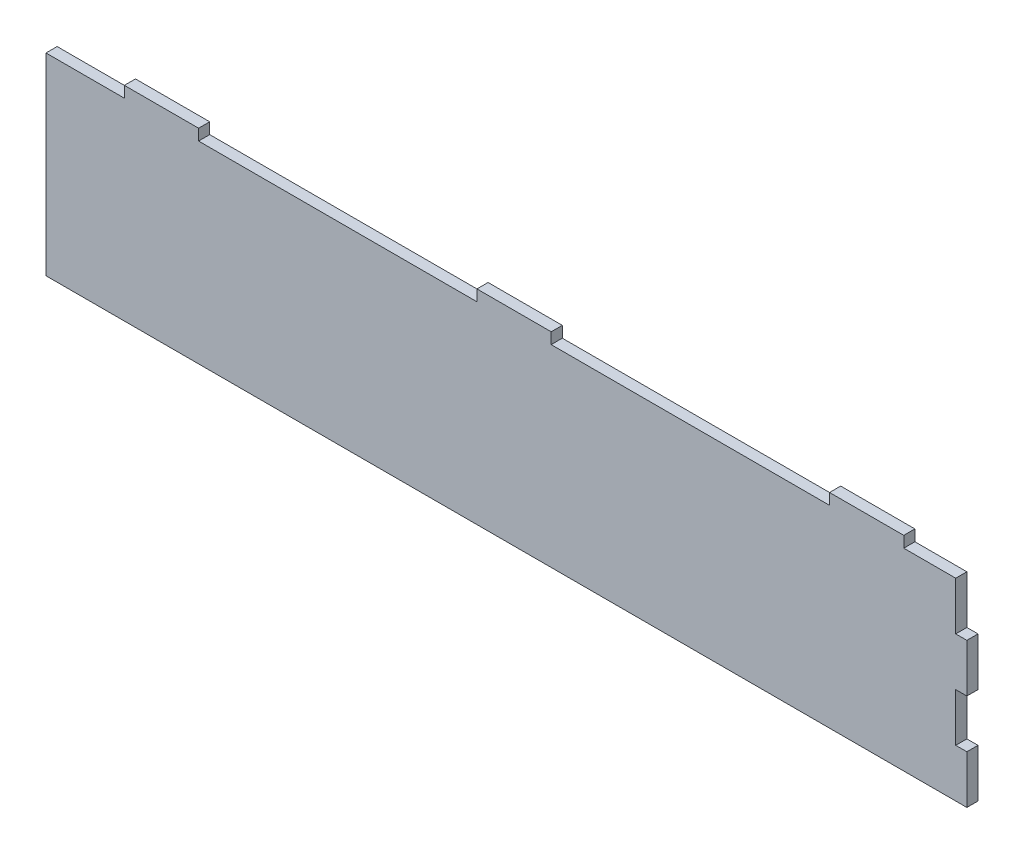
ISO-10303-21;
HEADER;
FILE_DESCRIPTION(('STEP AP214'),'2;1');
FILE_NAME('part.step','',(''),(''),'','','');
FILE_SCHEMA(('AUTOMOTIVE_DESIGN { 1 0 10303 214 1 1 1 1 }'));
ENDSEC;
DATA;
#1=APPLICATION_CONTEXT('core data for automotive mechanical design processes');
#2=APPLICATION_PROTOCOL_DEFINITION('international standard','automotive_design',2000,#1);
#3=PRODUCT_CONTEXT('',#1,'mechanical');
#4=PRODUCT('Part','Part','',(#3));
#5=PRODUCT_RELATED_PRODUCT_CATEGORY('part','',(#4));
#6=PRODUCT_DEFINITION_FORMATION('','',#4);
#7=PRODUCT_DEFINITION_CONTEXT('part definition',#1,'design');
#8=PRODUCT_DEFINITION('design','',#6,#7);
#9=PRODUCT_DEFINITION_SHAPE('','',#8);
#10=(LENGTH_UNIT() NAMED_UNIT(*) SI_UNIT(.MILLI.,.METRE.));
#11=(NAMED_UNIT(*) PLANE_ANGLE_UNIT() SI_UNIT($,.RADIAN.));
#12=(NAMED_UNIT(*) SI_UNIT($,.STERADIAN.) SOLID_ANGLE_UNIT());
#13=UNCERTAINTY_MEASURE_WITH_UNIT(LENGTH_MEASURE(1.E-05),#10,'distance_accuracy_value','');
#14=(GEOMETRIC_REPRESENTATION_CONTEXT(3) GLOBAL_UNCERTAINTY_ASSIGNED_CONTEXT((#13)) GLOBAL_UNIT_ASSIGNED_CONTEXT((#10,
#11,#12)) REPRESENTATION_CONTEXT('',''));
#15=CARTESIAN_POINT('',(0.,0.,0.));
#16=DIRECTION('',(0.,0.,1.));
#17=DIRECTION('',(1.,0.,0.));
#18=AXIS2_PLACEMENT_3D('',#15,#16,#17);
#19=CARTESIAN_POINT('',(123.554997344153,-14.463624238005,3.));
#20=DIRECTION('',(-1.,0.,0.));
#21=DIRECTION('',(0.,-1.,0.));
#22=AXIS2_PLACEMENT_3D('',#19,#20,#21);
#23=PLANE('',#22);
#24=DIRECTION('',(0.,1.,0.));
#25=VECTOR('',#24,1.);
#26=CARTESIAN_POINT('',(123.554997344153,-14.463624238005,0.));
#27=LINE('',#26,#25);
#28=CARTESIAN_POINT('',(123.554997344153,-27.463624238005,0.));
#29=VERTEX_POINT('',#28);
#30=CARTESIAN_POINT('',(123.554997344153,-14.463624238005,0.));
#31=VERTEX_POINT('',#30);
#32=EDGE_CURVE('E215',#29,#31,#27,.T.);
#33=ORIENTED_EDGE('',*,*,#32,.T.);
#34=DIRECTION('',(0.,0.,-1.));
#35=VECTOR('',#34,1.);
#36=CARTESIAN_POINT('',(123.554997344153,-14.463624238005,3.));
#37=LINE('',#36,#35);
#38=CARTESIAN_POINT('',(123.554997344153,-14.463624238005,3.));
#39=VERTEX_POINT('',#38);
#40=EDGE_CURVE('E11',#39,#31,#37,.T.);
#41=ORIENTED_EDGE('',*,*,#40,.F.);
#42=DIRECTION('',(0.,1.,0.));
#43=VECTOR('',#42,1.);
#44=CARTESIAN_POINT('',(123.554997344153,-14.463624238005,3.));
#45=LINE('',#44,#43);
#46=CARTESIAN_POINT('',(123.554997344153,-27.463624238005,3.));
#47=VERTEX_POINT('',#46);
#48=EDGE_CURVE('E257',#47,#39,#45,.T.);
#49=ORIENTED_EDGE('',*,*,#48,.F.);
#50=DIRECTION('',(0.,0.,-1.));
#51=VECTOR('',#50,1.);
#52=CARTESIAN_POINT('',(123.554997344153,-27.463624238005,3.));
#53=LINE('',#52,#51);
#54=EDGE_CURVE('E211',#47,#29,#53,.T.);
#55=ORIENTED_EDGE('',*,*,#54,.T.);
#56=EDGE_LOOP('',(#33,#41,#49,#55));
#57=FACE_BOUND('',#56,.T.);
#58=ADVANCED_FACE('F35',(#57),#23,.F.);
#59=CARTESIAN_POINT('',(120.554997344153,-14.463624238005,3.));
#60=DIRECTION('',(0.,-1.,0.));
#61=DIRECTION('',(0.,0.,-1.));
#62=AXIS2_PLACEMENT_3D('',#59,#60,#61);
#63=PLANE('',#62);
#64=DIRECTION('',(-1.,0.,0.));
#65=VECTOR('',#64,1.);
#66=CARTESIAN_POINT('',(120.554997344153,-14.463624238005,0.));
#67=LINE('',#66,#65);
#68=CARTESIAN_POINT('',(120.554997344153,-14.463624238005,0.));
#69=VERTEX_POINT('',#68);
#70=EDGE_CURVE('E218',#31,#69,#67,.T.);
#71=ORIENTED_EDGE('',*,*,#70,.T.);
#72=DIRECTION('',(0.,0.,-1.));
#73=VECTOR('',#72,1.);
#74=CARTESIAN_POINT('',(120.554997344153,-14.463624238005,3.));
#75=LINE('',#74,#73);
#76=CARTESIAN_POINT('',(120.554997344153,-14.463624238005,3.));
#77=VERTEX_POINT('',#76);
#78=EDGE_CURVE('E43',#77,#69,#75,.T.);
#79=ORIENTED_EDGE('',*,*,#78,.F.);
#80=DIRECTION('',(-1.,0.,0.));
#81=VECTOR('',#80,1.);
#82=CARTESIAN_POINT('',(120.554997344153,-14.463624238005,3.));
#83=LINE('',#82,#81);
#84=EDGE_CURVE('E136',#39,#77,#83,.T.);
#85=ORIENTED_EDGE('',*,*,#84,.F.);
#86=ORIENTED_EDGE('',*,*,#40,.T.);
#87=EDGE_LOOP('',(#71,#79,#85,#86));
#88=FACE_BOUND('',#87,.T.);
#89=ADVANCED_FACE('F385',(#88),#63,.F.);
#90=CARTESIAN_POINT('',(120.554997344153,-14.463624238005,3.));
#91=DIRECTION('',(-1.,0.,0.));
#92=DIRECTION('',(0.,-1.,0.));
#93=AXIS2_PLACEMENT_3D('',#90,#91,#92);
#94=PLANE('',#93);
#95=DIRECTION('',(0.,1.,0.));
#96=VECTOR('',#95,1.);
#97=CARTESIAN_POINT('',(120.554997344153,-14.463624238005,0.));
#98=LINE('',#97,#96);
#99=CARTESIAN_POINT('',(120.554997344153,-1.46362423800496,0.));
#100=VERTEX_POINT('',#99);
#101=EDGE_CURVE('E220',#69,#100,#98,.T.);
#102=ORIENTED_EDGE('',*,*,#101,.T.);
#103=DIRECTION('',(0.,0.,-1.));
#104=VECTOR('',#103,1.);
#105=CARTESIAN_POINT('',(120.554997344153,-1.46362423800496,3.));
#106=LINE('',#105,#104);
#107=CARTESIAN_POINT('',(120.554997344153,-1.46362423800496,3.));
#108=VERTEX_POINT('',#107);
#109=EDGE_CURVE('E306',#108,#100,#106,.T.);
#110=ORIENTED_EDGE('',*,*,#109,.F.);
#111=DIRECTION('',(0.,1.,0.));
#112=VECTOR('',#111,1.);
#113=CARTESIAN_POINT('',(120.554997344153,-14.463624238005,3.));
#114=LINE('',#113,#112);
#115=EDGE_CURVE('E314',#77,#108,#114,.T.);
#116=ORIENTED_EDGE('',*,*,#115,.F.);
#117=ORIENTED_EDGE('',*,*,#78,.T.);
#118=EDGE_LOOP('',(#102,#110,#116,#117));
#119=FACE_BOUND('',#118,.T.);
#120=ADVANCED_FACE('F312',(#119),#94,.F.);
#121=CARTESIAN_POINT('',(120.554997344153,-1.46362423800496,3.));
#122=DIRECTION('',(0.,1.,0.));
#123=DIRECTION('',(0.,0.,1.));
#124=AXIS2_PLACEMENT_3D('',#121,#122,#123);
#125=PLANE('',#124);
#126=DIRECTION('',(1.,0.,0.));
#127=VECTOR('',#126,1.);
#128=CARTESIAN_POINT('',(120.554997344153,-1.46362423800496,0.));
#129=LINE('',#128,#127);
#130=CARTESIAN_POINT('',(123.554997344153,-1.46362423800496,0.));
#131=VERTEX_POINT('',#130);
#132=EDGE_CURVE('E222',#100,#131,#129,.T.);
#133=ORIENTED_EDGE('',*,*,#132,.T.);
#134=DIRECTION('',(0.,0.,-1.));
#135=VECTOR('',#134,1.);
#136=CARTESIAN_POINT('',(123.554997344153,-1.46362423800496,3.));
#137=LINE('',#136,#135);
#138=CARTESIAN_POINT('',(123.554997344153,-1.46362423800496,3.));
#139=VERTEX_POINT('',#138);
#140=EDGE_CURVE('E303',#139,#131,#137,.T.);
#141=ORIENTED_EDGE('',*,*,#140,.F.);
#142=DIRECTION('',(1.,0.,0.));
#143=VECTOR('',#142,1.);
#144=CARTESIAN_POINT('',(120.554997344153,-1.46362423800496,3.));
#145=LINE('',#144,#143);
#146=EDGE_CURVE('E332',#108,#139,#145,.T.);
#147=ORIENTED_EDGE('',*,*,#146,.F.);
#148=ORIENTED_EDGE('',*,*,#109,.T.);
#149=EDGE_LOOP('',(#133,#141,#147,#148));
#150=FACE_BOUND('',#149,.T.);
#151=ADVANCED_FACE('F323',(#150),#125,.F.);
#152=CARTESIAN_POINT('',(123.554997344153,11.536375761995,3.));
#153=DIRECTION('',(-1.,0.,0.));
#154=DIRECTION('',(0.,-1.,0.));
#155=AXIS2_PLACEMENT_3D('',#152,#153,#154);
#156=PLANE('',#155);
#157=DIRECTION('',(0.,1.,0.));
#158=VECTOR('',#157,1.);
#159=CARTESIAN_POINT('',(123.554997344153,11.536375761995,0.));
#160=LINE('',#159,#158);
#161=CARTESIAN_POINT('',(123.554997344153,11.536375761995,0.));
#162=VERTEX_POINT('',#161);
#163=EDGE_CURVE('E224',#131,#162,#160,.T.);
#164=ORIENTED_EDGE('',*,*,#163,.T.);
#165=DIRECTION('',(0.,0.,-1.));
#166=VECTOR('',#165,1.);
#167=CARTESIAN_POINT('',(123.554997344153,11.536375761995,3.));
#168=LINE('',#167,#166);
#169=CARTESIAN_POINT('',(123.554997344153,11.536375761995,3.));
#170=VERTEX_POINT('',#169);
#171=EDGE_CURVE('E300',#170,#162,#168,.T.);
#172=ORIENTED_EDGE('',*,*,#171,.F.);
#173=DIRECTION('',(0.,1.,0.));
#174=VECTOR('',#173,1.);
#175=CARTESIAN_POINT('',(123.554997344153,11.536375761995,3.));
#176=LINE('',#175,#174);
#177=EDGE_CURVE('E329',#139,#170,#176,.T.);
#178=ORIENTED_EDGE('',*,*,#177,.F.);
#179=ORIENTED_EDGE('',*,*,#140,.T.);
#180=EDGE_LOOP('',(#164,#172,#178,#179));
#181=FACE_BOUND('',#180,.T.);
#182=ADVANCED_FACE('F327',(#181),#156,.F.);
#183=CARTESIAN_POINT('',(120.554997344153,11.536375761995,3.));
#184=DIRECTION('',(0.,-1.,0.));
#185=DIRECTION('',(0.,0.,-1.));
#186=AXIS2_PLACEMENT_3D('',#183,#184,#185);
#187=PLANE('',#186);
#188=DIRECTION('',(-1.,0.,0.));
#189=VECTOR('',#188,1.);
#190=CARTESIAN_POINT('',(120.554997344153,11.536375761995,0.));
#191=LINE('',#190,#189);
#192=CARTESIAN_POINT('',(120.554997344153,11.536375761995,0.));
#193=VERTEX_POINT('',#192);
#194=EDGE_CURVE('E226',#162,#193,#191,.T.);
#195=ORIENTED_EDGE('',*,*,#194,.T.);
#196=DIRECTION('',(0.,0.,-1.));
#197=VECTOR('',#196,1.);
#198=CARTESIAN_POINT('',(120.554997344153,11.536375761995,3.));
#199=LINE('',#198,#197);
#200=CARTESIAN_POINT('',(120.554997344153,11.536375761995,3.));
#201=VERTEX_POINT('',#200);
#202=EDGE_CURVE('E297',#201,#193,#199,.T.);
#203=ORIENTED_EDGE('',*,*,#202,.F.);
#204=DIRECTION('',(-1.,0.,0.));
#205=VECTOR('',#204,1.);
#206=CARTESIAN_POINT('',(120.554997344153,11.536375761995,3.));
#207=LINE('',#206,#205);
#208=EDGE_CURVE('E331',#170,#201,#207,.T.);
#209=ORIENTED_EDGE('',*,*,#208,.F.);
#210=ORIENTED_EDGE('',*,*,#171,.T.);
#211=EDGE_LOOP('',(#195,#203,#209,#210));
#212=FACE_BOUND('',#211,.T.);
#213=ADVANCED_FACE('F398',(#212),#187,.F.);
#214=CARTESIAN_POINT('',(120.554997344153,11.536375761995,3.));
#215=DIRECTION('',(-1.,0.,0.));
#216=DIRECTION('',(0.,0.,1.));
#217=AXIS2_PLACEMENT_3D('',#214,#215,#216);
#218=PLANE('',#217);
#219=DIRECTION('',(0.,1.,0.));
#220=VECTOR('',#219,1.);
#221=CARTESIAN_POINT('',(120.554997344153,11.536375761995,0.));
#222=LINE('',#221,#220);
#223=CARTESIAN_POINT('',(120.554997344153,24.536375761995,0.));
#224=VERTEX_POINT('',#223);
#225=EDGE_CURVE('E228',#193,#224,#222,.T.);
#226=ORIENTED_EDGE('',*,*,#225,.T.);
#227=DIRECTION('',(0.,0.,-1.));
#228=VECTOR('',#227,1.);
#229=CARTESIAN_POINT('',(120.554997344153,24.536375761995,3.));
#230=LINE('',#229,#228);
#231=CARTESIAN_POINT('',(120.554997344153,24.536375761995,3.));
#232=VERTEX_POINT('',#231);
#233=EDGE_CURVE('E294',#232,#224,#230,.T.);
#234=ORIENTED_EDGE('',*,*,#233,.F.);
#235=DIRECTION('',(0.,1.,0.));
#236=VECTOR('',#235,1.);
#237=CARTESIAN_POINT('',(120.554997344153,11.536375761995,3.));
#238=LINE('',#237,#236);
#239=EDGE_CURVE('E334',#201,#232,#238,.T.);
#240=ORIENTED_EDGE('',*,*,#239,.F.);
#241=ORIENTED_EDGE('',*,*,#202,.T.);
#242=EDGE_LOOP('',(#226,#234,#240,#241));
#243=FACE_BOUND('',#242,.T.);
#244=ADVANCED_FACE('F401',(#243),#218,.F.);
#245=CARTESIAN_POINT('',(106.554997344153,24.536375761995,3.));
#246=DIRECTION('',(0.,-1.,0.));
#247=DIRECTION('',(0.,0.,-1.));
#248=AXIS2_PLACEMENT_3D('',#245,#246,#247);
#249=PLANE('',#248);
#250=DIRECTION('',(-1.,0.,0.));
#251=VECTOR('',#250,1.);
#252=CARTESIAN_POINT('',(106.554997344153,24.536375761995,0.));
#253=LINE('',#252,#251);
#254=CARTESIAN_POINT('',(106.554997344153,24.536375761995,0.));
#255=VERTEX_POINT('',#254);
#256=EDGE_CURVE('E230',#224,#255,#253,.T.);
#257=ORIENTED_EDGE('',*,*,#256,.T.);
#258=DIRECTION('',(0.,0.,-1.));
#259=VECTOR('',#258,1.);
#260=CARTESIAN_POINT('',(106.554997344153,24.536375761995,3.));
#261=LINE('',#260,#259);
#262=CARTESIAN_POINT('',(106.554997344153,24.536375761995,3.));
#263=VERTEX_POINT('',#262);
#264=EDGE_CURVE('E291',#263,#255,#261,.T.);
#265=ORIENTED_EDGE('',*,*,#264,.F.);
#266=DIRECTION('',(-1.,0.,0.));
#267=VECTOR('',#266,1.);
#268=CARTESIAN_POINT('',(106.554997344153,24.536375761995,3.));
#269=LINE('',#268,#267);
#270=EDGE_CURVE('E340',#232,#263,#269,.T.);
#271=ORIENTED_EDGE('',*,*,#270,.F.);
#272=ORIENTED_EDGE('',*,*,#233,.T.);
#273=EDGE_LOOP('',(#257,#265,#271,#272));
#274=FACE_BOUND('',#273,.T.);
#275=ADVANCED_FACE('F405',(#274),#249,.F.);
#276=CARTESIAN_POINT('',(106.554997344153,27.536375761995,3.));
#277=DIRECTION('',(-1.,0.,0.));
#278=DIRECTION('',(0.,0.,1.));
#279=AXIS2_PLACEMENT_3D('',#276,#277,#278);
#280=PLANE('',#279);
#281=DIRECTION('',(0.,1.,0.));
#282=VECTOR('',#281,1.);
#283=CARTESIAN_POINT('',(106.554997344153,27.536375761995,0.));
#284=LINE('',#283,#282);
#285=CARTESIAN_POINT('',(106.554997344153,27.536375761995,0.));
#286=VERTEX_POINT('',#285);
#287=EDGE_CURVE('E232',#255,#286,#284,.T.);
#288=ORIENTED_EDGE('',*,*,#287,.T.);
#289=DIRECTION('',(0.,0.,-1.));
#290=VECTOR('',#289,1.);
#291=CARTESIAN_POINT('',(106.554997344153,27.536375761995,3.));
#292=LINE('',#291,#290);
#293=CARTESIAN_POINT('',(106.554997344153,27.536375761995,3.));
#294=VERTEX_POINT('',#293);
#295=EDGE_CURVE('E288',#294,#286,#292,.T.);
#296=ORIENTED_EDGE('',*,*,#295,.F.);
#297=DIRECTION('',(0.,1.,0.));
#298=VECTOR('',#297,1.);
#299=CARTESIAN_POINT('',(106.554997344153,27.536375761995,3.));
#300=LINE('',#299,#298);
#301=EDGE_CURVE('E342',#263,#294,#300,.T.);
#302=ORIENTED_EDGE('',*,*,#301,.F.);
#303=ORIENTED_EDGE('',*,*,#264,.T.);
#304=EDGE_LOOP('',(#288,#296,#302,#303));
#305=FACE_BOUND('',#304,.T.);
#306=ADVANCED_FACE('F409',(#305),#280,.F.);
#307=CARTESIAN_POINT('',(86.554997344153,27.536375761995,3.));
#308=DIRECTION('',(0.,-1.,0.));
#309=DIRECTION('',(0.,0.,-1.));
#310=AXIS2_PLACEMENT_3D('',#307,#308,#309);
#311=PLANE('',#310);
#312=DIRECTION('',(-1.,0.,0.));
#313=VECTOR('',#312,1.);
#314=CARTESIAN_POINT('',(86.554997344153,27.536375761995,0.));
#315=LINE('',#314,#313);
#316=CARTESIAN_POINT('',(86.554997344153,27.536375761995,0.));
#317=VERTEX_POINT('',#316);
#318=EDGE_CURVE('E234',#286,#317,#315,.T.);
#319=ORIENTED_EDGE('',*,*,#318,.T.);
#320=DIRECTION('',(0.,0.,-1.));
#321=VECTOR('',#320,1.);
#322=CARTESIAN_POINT('',(86.554997344153,27.536375761995,3.));
#323=LINE('',#322,#321);
#324=CARTESIAN_POINT('',(86.554997344153,27.536375761995,3.));
#325=VERTEX_POINT('',#324);
#326=EDGE_CURVE('E285',#325,#317,#323,.T.);
#327=ORIENTED_EDGE('',*,*,#326,.F.);
#328=DIRECTION('',(-1.,0.,0.));
#329=VECTOR('',#328,1.);
#330=CARTESIAN_POINT('',(86.554997344153,27.536375761995,3.));
#331=LINE('',#330,#329);
#332=EDGE_CURVE('E344',#294,#325,#331,.T.);
#333=ORIENTED_EDGE('',*,*,#332,.F.);
#334=ORIENTED_EDGE('',*,*,#295,.T.);
#335=EDGE_LOOP('',(#319,#327,#333,#334));
#336=FACE_BOUND('',#335,.T.);
#337=ADVANCED_FACE('F413',(#336),#311,.F.);
#338=CARTESIAN_POINT('',(86.554997344153,27.536375761995,3.));
#339=DIRECTION('',(1.,0.,0.));
#340=DIRECTION('',(0.,0.,-1.));
#341=AXIS2_PLACEMENT_3D('',#338,#339,#340);
#342=PLANE('',#341);
#343=DIRECTION('',(0.,-1.,0.));
#344=VECTOR('',#343,1.);
#345=CARTESIAN_POINT('',(86.554997344153,27.536375761995,0.));
#346=LINE('',#345,#344);
#347=CARTESIAN_POINT('',(86.554997344153,24.536375761995,0.));
#348=VERTEX_POINT('',#347);
#349=EDGE_CURVE('E236',#317,#348,#346,.T.);
#350=ORIENTED_EDGE('',*,*,#349,.T.);
#351=DIRECTION('',(0.,0.,-1.));
#352=VECTOR('',#351,1.);
#353=CARTESIAN_POINT('',(86.554997344153,24.536375761995,3.));
#354=LINE('',#353,#352);
#355=CARTESIAN_POINT('',(86.554997344153,24.536375761995,3.));
#356=VERTEX_POINT('',#355);
#357=EDGE_CURVE('E282',#356,#348,#354,.T.);
#358=ORIENTED_EDGE('',*,*,#357,.F.);
#359=DIRECTION('',(0.,-1.,0.));
#360=VECTOR('',#359,1.);
#361=CARTESIAN_POINT('',(86.554997344153,27.536375761995,3.));
#362=LINE('',#361,#360);
#363=EDGE_CURVE('E346',#325,#356,#362,.T.);
#364=ORIENTED_EDGE('',*,*,#363,.F.);
#365=ORIENTED_EDGE('',*,*,#326,.T.);
#366=EDGE_LOOP('',(#350,#358,#364,#365));
#367=FACE_BOUND('',#366,.T.);
#368=ADVANCED_FACE('F417',(#367),#342,.F.);
#369=CARTESIAN_POINT('',(11.554997344153,24.536375761995,3.));
#370=DIRECTION('',(0.,-1.,0.));
#371=DIRECTION('',(0.,0.,-1.));
#372=AXIS2_PLACEMENT_3D('',#369,#370,#371);
#373=PLANE('',#372);
#374=DIRECTION('',(-1.,0.,0.));
#375=VECTOR('',#374,1.);
#376=CARTESIAN_POINT('',(11.554997344153,24.536375761995,0.));
#377=LINE('',#376,#375);
#378=CARTESIAN_POINT('',(11.554997344153,24.536375761995,0.));
#379=VERTEX_POINT('',#378);
#380=EDGE_CURVE('E238',#348,#379,#377,.T.);
#381=ORIENTED_EDGE('',*,*,#380,.T.);
#382=DIRECTION('',(0.,0.,-1.));
#383=VECTOR('',#382,1.);
#384=CARTESIAN_POINT('',(11.554997344153,24.536375761995,3.));
#385=LINE('',#384,#383);
#386=CARTESIAN_POINT('',(11.554997344153,24.536375761995,3.));
#387=VERTEX_POINT('',#386);
#388=EDGE_CURVE('E279',#387,#379,#385,.T.);
#389=ORIENTED_EDGE('',*,*,#388,.F.);
#390=DIRECTION('',(-1.,0.,0.));
#391=VECTOR('',#390,1.);
#392=CARTESIAN_POINT('',(11.554997344153,24.536375761995,3.));
#393=LINE('',#392,#391);
#394=EDGE_CURVE('E348',#356,#387,#393,.T.);
#395=ORIENTED_EDGE('',*,*,#394,.F.);
#396=ORIENTED_EDGE('',*,*,#357,.T.);
#397=EDGE_LOOP('',(#381,#389,#395,#396));
#398=FACE_BOUND('',#397,.T.);
#399=ADVANCED_FACE('F421',(#398),#373,.F.);
#400=CARTESIAN_POINT('',(11.554997344153,27.536375761995,3.));
#401=DIRECTION('',(-1.,0.,0.));
#402=DIRECTION('',(0.,0.,1.));
#403=AXIS2_PLACEMENT_3D('',#400,#401,#402);
#404=PLANE('',#403);
#405=DIRECTION('',(0.,1.,0.));
#406=VECTOR('',#405,1.);
#407=CARTESIAN_POINT('',(11.554997344153,27.536375761995,0.));
#408=LINE('',#407,#406);
#409=CARTESIAN_POINT('',(11.554997344153,27.536375761995,0.));
#410=VERTEX_POINT('',#409);
#411=EDGE_CURVE('E240',#379,#410,#408,.T.);
#412=ORIENTED_EDGE('',*,*,#411,.T.);
#413=DIRECTION('',(0.,0.,-1.));
#414=VECTOR('',#413,1.);
#415=CARTESIAN_POINT('',(11.554997344153,27.536375761995,3.));
#416=LINE('',#415,#414);
#417=CARTESIAN_POINT('',(11.554997344153,27.536375761995,3.));
#418=VERTEX_POINT('',#417);
#419=EDGE_CURVE('E276',#418,#410,#416,.T.);
#420=ORIENTED_EDGE('',*,*,#419,.F.);
#421=DIRECTION('',(0.,1.,0.));
#422=VECTOR('',#421,1.);
#423=CARTESIAN_POINT('',(11.554997344153,27.536375761995,3.));
#424=LINE('',#423,#422);
#425=EDGE_CURVE('E350',#387,#418,#424,.T.);
#426=ORIENTED_EDGE('',*,*,#425,.F.);
#427=ORIENTED_EDGE('',*,*,#388,.T.);
#428=EDGE_LOOP('',(#412,#420,#426,#427));
#429=FACE_BOUND('',#428,.T.);
#430=ADVANCED_FACE('F425',(#429),#404,.F.);
#431=CARTESIAN_POINT('',(-8.44500265584698,27.536375761995,3.));
#432=DIRECTION('',(0.,-1.,0.));
#433=DIRECTION('',(0.,0.,-1.));
#434=AXIS2_PLACEMENT_3D('',#431,#432,#433);
#435=PLANE('',#434);
#436=DIRECTION('',(-1.,0.,0.));
#437=VECTOR('',#436,1.);
#438=CARTESIAN_POINT('',(-8.44500265584698,27.536375761995,0.));
#439=LINE('',#438,#437);
#440=CARTESIAN_POINT('',(-8.44500265584698,27.536375761995,0.));
#441=VERTEX_POINT('',#440);
#442=EDGE_CURVE('E242',#410,#441,#439,.T.);
#443=ORIENTED_EDGE('',*,*,#442,.T.);
#444=DIRECTION('',(0.,0.,-1.));
#445=VECTOR('',#444,1.);
#446=CARTESIAN_POINT('',(-8.44500265584698,27.536375761995,3.));
#447=LINE('',#446,#445);
#448=CARTESIAN_POINT('',(-8.44500265584698,27.536375761995,3.));
#449=VERTEX_POINT('',#448);
#450=EDGE_CURVE('E273',#449,#441,#447,.T.);
#451=ORIENTED_EDGE('',*,*,#450,.F.);
#452=DIRECTION('',(-1.,0.,0.));
#453=VECTOR('',#452,1.);
#454=CARTESIAN_POINT('',(-8.44500265584698,27.536375761995,3.));
#455=LINE('',#454,#453);
#456=EDGE_CURVE('E352',#418,#449,#455,.T.);
#457=ORIENTED_EDGE('',*,*,#456,.F.);
#458=ORIENTED_EDGE('',*,*,#419,.T.);
#459=EDGE_LOOP('',(#443,#451,#457,#458));
#460=FACE_BOUND('',#459,.T.);
#461=ADVANCED_FACE('F429',(#460),#435,.F.);
#462=CARTESIAN_POINT('',(-8.44500265584698,27.536375761995,3.));
#463=DIRECTION('',(1.,0.,0.));
#464=DIRECTION('',(0.,0.,-1.));
#465=AXIS2_PLACEMENT_3D('',#462,#463,#464);
#466=PLANE('',#465);
#467=DIRECTION('',(0.,-1.,0.));
#468=VECTOR('',#467,1.);
#469=CARTESIAN_POINT('',(-8.44500265584698,27.536375761995,0.));
#470=LINE('',#469,#468);
#471=CARTESIAN_POINT('',(-8.44500265584698,24.536375761995,0.));
#472=VERTEX_POINT('',#471);
#473=EDGE_CURVE('E244',#441,#472,#470,.T.);
#474=ORIENTED_EDGE('',*,*,#473,.T.);
#475=DIRECTION('',(0.,0.,-1.));
#476=VECTOR('',#475,1.);
#477=CARTESIAN_POINT('',(-8.44500265584698,24.536375761995,3.));
#478=LINE('',#477,#476);
#479=CARTESIAN_POINT('',(-8.44500265584698,24.536375761995,3.));
#480=VERTEX_POINT('',#479);
#481=EDGE_CURVE('E270',#480,#472,#478,.T.);
#482=ORIENTED_EDGE('',*,*,#481,.F.);
#483=DIRECTION('',(0.,-1.,0.));
#484=VECTOR('',#483,1.);
#485=CARTESIAN_POINT('',(-8.44500265584698,27.536375761995,3.));
#486=LINE('',#485,#484);
#487=EDGE_CURVE('E354',#449,#480,#486,.T.);
#488=ORIENTED_EDGE('',*,*,#487,.F.);
#489=ORIENTED_EDGE('',*,*,#450,.T.);
#490=EDGE_LOOP('',(#474,#482,#488,#489));
#491=FACE_BOUND('',#490,.T.);
#492=ADVANCED_FACE('F433',(#491),#466,.F.);
#493=CARTESIAN_POINT('',(-83.445002655847,24.536375761995,3.));
#494=DIRECTION('',(0.,-1.,0.));
#495=DIRECTION('',(0.,0.,-1.));
#496=AXIS2_PLACEMENT_3D('',#493,#494,#495);
#497=PLANE('',#496);
#498=DIRECTION('',(-1.,0.,0.));
#499=VECTOR('',#498,1.);
#500=CARTESIAN_POINT('',(-83.445002655847,24.536375761995,0.));
#501=LINE('',#500,#499);
#502=CARTESIAN_POINT('',(-83.445002655847,24.536375761995,0.));
#503=VERTEX_POINT('',#502);
#504=EDGE_CURVE('E246',#472,#503,#501,.T.);
#505=ORIENTED_EDGE('',*,*,#504,.T.);
#506=DIRECTION('',(0.,0.,-1.));
#507=VECTOR('',#506,1.);
#508=CARTESIAN_POINT('',(-83.445002655847,24.536375761995,3.));
#509=LINE('',#508,#507);
#510=CARTESIAN_POINT('',(-83.445002655847,24.536375761995,3.));
#511=VERTEX_POINT('',#510);
#512=EDGE_CURVE('E267',#511,#503,#509,.T.);
#513=ORIENTED_EDGE('',*,*,#512,.F.);
#514=DIRECTION('',(-1.,0.,0.));
#515=VECTOR('',#514,1.);
#516=CARTESIAN_POINT('',(-83.445002655847,24.536375761995,3.));
#517=LINE('',#516,#515);
#518=EDGE_CURVE('E356',#480,#511,#517,.T.);
#519=ORIENTED_EDGE('',*,*,#518,.F.);
#520=ORIENTED_EDGE('',*,*,#481,.T.);
#521=EDGE_LOOP('',(#505,#513,#519,#520));
#522=FACE_BOUND('',#521,.T.);
#523=ADVANCED_FACE('F437',(#522),#497,.F.);
#524=CARTESIAN_POINT('',(-83.445002655847,27.536375761995,3.));
#525=DIRECTION('',(-1.,0.,0.));
#526=DIRECTION('',(0.,0.,1.));
#527=AXIS2_PLACEMENT_3D('',#524,#525,#526);
#528=PLANE('',#527);
#529=DIRECTION('',(0.,1.,0.));
#530=VECTOR('',#529,1.);
#531=CARTESIAN_POINT('',(-83.445002655847,27.536375761995,0.));
#532=LINE('',#531,#530);
#533=CARTESIAN_POINT('',(-83.445002655847,27.536375761995,0.));
#534=VERTEX_POINT('',#533);
#535=EDGE_CURVE('E248',#503,#534,#532,.T.);
#536=ORIENTED_EDGE('',*,*,#535,.T.);
#537=DIRECTION('',(0.,0.,-1.));
#538=VECTOR('',#537,1.);
#539=CARTESIAN_POINT('',(-83.445002655847,27.536375761995,3.));
#540=LINE('',#539,#538);
#541=CARTESIAN_POINT('',(-83.445002655847,27.536375761995,3.));
#542=VERTEX_POINT('',#541);
#543=EDGE_CURVE('E264',#542,#534,#540,.T.);
#544=ORIENTED_EDGE('',*,*,#543,.F.);
#545=DIRECTION('',(0.,1.,0.));
#546=VECTOR('',#545,1.);
#547=CARTESIAN_POINT('',(-83.445002655847,27.536375761995,3.));
#548=LINE('',#547,#546);
#549=EDGE_CURVE('E358',#511,#542,#548,.T.);
#550=ORIENTED_EDGE('',*,*,#549,.F.);
#551=ORIENTED_EDGE('',*,*,#512,.T.);
#552=EDGE_LOOP('',(#536,#544,#550,#551));
#553=FACE_BOUND('',#552,.T.);
#554=ADVANCED_FACE('F441',(#553),#528,.F.);
#555=CARTESIAN_POINT('',(-103.445002655847,27.536375761995,3.));
#556=DIRECTION('',(0.,-1.,0.));
#557=DIRECTION('',(0.,0.,-1.));
#558=AXIS2_PLACEMENT_3D('',#555,#556,#557);
#559=PLANE('',#558);
#560=DIRECTION('',(-1.,0.,0.));
#561=VECTOR('',#560,1.);
#562=CARTESIAN_POINT('',(-103.445002655847,27.536375761995,0.));
#563=LINE('',#562,#561);
#564=CARTESIAN_POINT('',(-103.445002655847,27.536375761995,0.));
#565=VERTEX_POINT('',#564);
#566=EDGE_CURVE('E250',#534,#565,#563,.T.);
#567=ORIENTED_EDGE('',*,*,#566,.T.);
#568=DIRECTION('',(0.,0.,-1.));
#569=VECTOR('',#568,1.);
#570=CARTESIAN_POINT('',(-103.445002655847,27.536375761995,3.));
#571=LINE('',#570,#569);
#572=CARTESIAN_POINT('',(-103.445002655847,27.536375761995,3.));
#573=VERTEX_POINT('',#572);
#574=EDGE_CURVE('E261',#573,#565,#571,.T.);
#575=ORIENTED_EDGE('',*,*,#574,.F.);
#576=DIRECTION('',(-1.,0.,0.));
#577=VECTOR('',#576,1.);
#578=CARTESIAN_POINT('',(-103.445002655847,27.536375761995,3.));
#579=LINE('',#578,#577);
#580=EDGE_CURVE('E360',#542,#573,#579,.T.);
#581=ORIENTED_EDGE('',*,*,#580,.F.);
#582=ORIENTED_EDGE('',*,*,#543,.T.);
#583=EDGE_LOOP('',(#567,#575,#581,#582));
#584=FACE_BOUND('',#583,.T.);
#585=ADVANCED_FACE('F366',(#584),#559,.F.);
#586=CARTESIAN_POINT('',(-103.445002655847,27.536375761995,3.));
#587=DIRECTION('',(1.,0.,0.));
#588=DIRECTION('',(0.,0.,-1.));
#589=AXIS2_PLACEMENT_3D('',#586,#587,#588);
#590=PLANE('',#589);
#591=DIRECTION('',(0.,-1.,0.));
#592=VECTOR('',#591,1.);
#593=CARTESIAN_POINT('',(-103.445002655847,27.536375761995,0.));
#594=LINE('',#593,#592);
#595=CARTESIAN_POINT('',(-103.445002655847,24.536375761995,0.));
#596=VERTEX_POINT('',#595);
#597=EDGE_CURVE('E252',#565,#596,#594,.T.);
#598=ORIENTED_EDGE('',*,*,#597,.T.);
#599=DIRECTION('',(0.,0.,-1.));
#600=VECTOR('',#599,1.);
#601=CARTESIAN_POINT('',(-103.445002655847,24.536375761995,3.));
#602=LINE('',#601,#600);
#603=CARTESIAN_POINT('',(-103.445002655847,24.536375761995,3.));
#604=VERTEX_POINT('',#603);
#605=EDGE_CURVE('E206',#604,#596,#602,.T.);
#606=ORIENTED_EDGE('',*,*,#605,.F.);
#607=DIRECTION('',(0.,-1.,0.));
#608=VECTOR('',#607,1.);
#609=CARTESIAN_POINT('',(-103.445002655847,27.536375761995,3.));
#610=LINE('',#609,#608);
#611=EDGE_CURVE('E197',#573,#604,#610,.T.);
#612=ORIENTED_EDGE('',*,*,#611,.F.);
#613=ORIENTED_EDGE('',*,*,#574,.T.);
#614=EDGE_LOOP('',(#598,#606,#612,#613));
#615=FACE_BOUND('',#614,.T.);
#616=ADVANCED_FACE('F370',(#615),#590,.F.);
#617=CARTESIAN_POINT('',(-124.555002655847,24.536375761995,3.));
#618=DIRECTION('',(0.,-1.,0.));
#619=DIRECTION('',(0.,0.,-1.));
#620=AXIS2_PLACEMENT_3D('',#617,#618,#619);
#621=PLANE('',#620);
#622=DIRECTION('',(-1.,0.,0.));
#623=VECTOR('',#622,1.);
#624=CARTESIAN_POINT('',(-124.555002655847,24.536375761995,0.));
#625=LINE('',#624,#623);
#626=CARTESIAN_POINT('',(-124.555002655847,24.536375761995,0.));
#627=VERTEX_POINT('',#626);
#628=EDGE_CURVE('E205',#596,#627,#625,.T.);
#629=ORIENTED_EDGE('',*,*,#628,.T.);
#630=DIRECTION('',(0.,0.,-1.));
#631=VECTOR('',#630,1.);
#632=CARTESIAN_POINT('',(-124.555002655847,24.536375761995,3.));
#633=LINE('',#632,#631);
#634=CARTESIAN_POINT('',(-124.555002655847,24.536375761995,3.));
#635=VERTEX_POINT('',#634);
#636=EDGE_CURVE('E202',#635,#627,#633,.T.);
#637=ORIENTED_EDGE('',*,*,#636,.F.);
#638=DIRECTION('',(-1.,0.,0.));
#639=VECTOR('',#638,1.);
#640=CARTESIAN_POINT('',(-124.555002655847,24.536375761995,3.));
#641=LINE('',#640,#639);
#642=EDGE_CURVE('E191',#604,#635,#641,.T.);
#643=ORIENTED_EDGE('',*,*,#642,.F.);
#644=ORIENTED_EDGE('',*,*,#605,.T.);
#645=EDGE_LOOP('',(#629,#637,#643,#644));
#646=FACE_BOUND('',#645,.T.);
#647=ADVANCED_FACE('F203',(#646),#621,.F.);
#648=CARTESIAN_POINT('',(-124.555002655847,24.536375761995,3.));
#649=DIRECTION('',(1.,0.,0.));
#650=DIRECTION('',(0.,0.,-1.));
#651=AXIS2_PLACEMENT_3D('',#648,#649,#650);
#652=PLANE('',#651);
#653=DIRECTION('',(0.,-1.,0.));
#654=VECTOR('',#653,1.);
#655=CARTESIAN_POINT('',(-124.555002655847,24.536375761995,0.));
#656=LINE('',#655,#654);
#657=CARTESIAN_POINT('',(-124.555002655847,-27.463624238005,0.));
#658=VERTEX_POINT('',#657);
#659=EDGE_CURVE('E122',#627,#658,#656,.T.);
#660=ORIENTED_EDGE('',*,*,#659,.T.);
#661=DIRECTION('',(0.,0.,-1.));
#662=VECTOR('',#661,1.);
#663=CARTESIAN_POINT('',(-124.555002655847,-27.463624238005,3.));
#664=LINE('',#663,#662);
#665=CARTESIAN_POINT('',(-124.555002655847,-27.463624238005,3.));
#666=VERTEX_POINT('',#665);
#667=EDGE_CURVE('E207',#666,#658,#664,.T.);
#668=ORIENTED_EDGE('',*,*,#667,.F.);
#669=DIRECTION('',(0.,-1.,0.));
#670=VECTOR('',#669,1.);
#671=CARTESIAN_POINT('',(-124.555002655847,24.536375761995,3.));
#672=LINE('',#671,#670);
#673=EDGE_CURVE('E195',#635,#666,#672,.T.);
#674=ORIENTED_EDGE('',*,*,#673,.F.);
#675=ORIENTED_EDGE('',*,*,#636,.T.);
#676=EDGE_LOOP('',(#660,#668,#674,#675));
#677=FACE_BOUND('',#676,.T.);
#678=ADVANCED_FACE('F209',(#677),#652,.F.);
#679=CARTESIAN_POINT('',(-124.555002655847,-27.463624238005,3.));
#680=DIRECTION('',(0.,1.,0.));
#681=DIRECTION('',(0.,0.,1.));
#682=AXIS2_PLACEMENT_3D('',#679,#680,#681);
#683=PLANE('',#682);
#684=DIRECTION('',(1.,0.,0.));
#685=VECTOR('',#684,1.);
#686=CARTESIAN_POINT('',(-124.555002655847,-27.463624238005,0.));
#687=LINE('',#686,#685);
#688=EDGE_CURVE('E128',#658,#29,#687,.T.);
#689=ORIENTED_EDGE('',*,*,#688,.T.);
#690=ORIENTED_EDGE('',*,*,#54,.F.);
#691=DIRECTION('',(1.,0.,0.));
#692=VECTOR('',#691,1.);
#693=CARTESIAN_POINT('',(-124.555002655847,-27.463624238005,3.));
#694=LINE('',#693,#692);
#695=EDGE_CURVE('E51',#666,#47,#694,.T.);
#696=ORIENTED_EDGE('',*,*,#695,.F.);
#697=ORIENTED_EDGE('',*,*,#667,.T.);
#698=EDGE_LOOP('',(#689,#690,#696,#697));
#699=FACE_BOUND('',#698,.T.);
#700=ADVANCED_FACE('F374',(#699),#683,.F.);
#701=CARTESIAN_POINT('',(0.,0.,3.));
#702=DIRECTION('',(0.,0.,1.));
#703=DIRECTION('',(1.,0.,0.));
#704=AXIS2_PLACEMENT_3D('',#701,#702,#703);
#705=PLANE('',#704);
#706=ORIENTED_EDGE('',*,*,#48,.T.);
#707=ORIENTED_EDGE('',*,*,#84,.T.);
#708=ORIENTED_EDGE('',*,*,#115,.T.);
#709=ORIENTED_EDGE('',*,*,#146,.T.);
#710=ORIENTED_EDGE('',*,*,#177,.T.);
#711=ORIENTED_EDGE('',*,*,#208,.T.);
#712=ORIENTED_EDGE('',*,*,#239,.T.);
#713=ORIENTED_EDGE('',*,*,#270,.T.);
#714=ORIENTED_EDGE('',*,*,#301,.T.);
#715=ORIENTED_EDGE('',*,*,#332,.T.);
#716=ORIENTED_EDGE('',*,*,#363,.T.);
#717=ORIENTED_EDGE('',*,*,#394,.T.);
#718=ORIENTED_EDGE('',*,*,#425,.T.);
#719=ORIENTED_EDGE('',*,*,#456,.T.);
#720=ORIENTED_EDGE('',*,*,#487,.T.);
#721=ORIENTED_EDGE('',*,*,#518,.T.);
#722=ORIENTED_EDGE('',*,*,#549,.T.);
#723=ORIENTED_EDGE('',*,*,#580,.T.);
#724=ORIENTED_EDGE('',*,*,#611,.T.);
#725=ORIENTED_EDGE('',*,*,#642,.T.);
#726=ORIENTED_EDGE('',*,*,#673,.T.);
#727=ORIENTED_EDGE('',*,*,#695,.T.);
#728=EDGE_LOOP('',(#706,#707,#708,#709,#710,#711,#712,#713,#714,#715,#716,#717,#718,#719,#720,
#721,#722,#723,#724,#725,#726,#727));
#729=FACE_BOUND('',#728,.T.);
#730=ADVANCED_FACE('F193',(#729),#705,.T.);
#731=CARTESIAN_POINT('',(0.,0.,0.));
#732=DIRECTION('',(0.,0.,1.));
#733=DIRECTION('',(1.,0.,0.));
#734=AXIS2_PLACEMENT_3D('',#731,#732,#733);
#735=PLANE('',#734);
#736=ORIENTED_EDGE('',*,*,#32,.F.);
#737=ORIENTED_EDGE('',*,*,#688,.F.);
#738=ORIENTED_EDGE('',*,*,#659,.F.);
#739=ORIENTED_EDGE('',*,*,#628,.F.);
#740=ORIENTED_EDGE('',*,*,#597,.F.);
#741=ORIENTED_EDGE('',*,*,#566,.F.);
#742=ORIENTED_EDGE('',*,*,#535,.F.);
#743=ORIENTED_EDGE('',*,*,#504,.F.);
#744=ORIENTED_EDGE('',*,*,#473,.F.);
#745=ORIENTED_EDGE('',*,*,#442,.F.);
#746=ORIENTED_EDGE('',*,*,#411,.F.);
#747=ORIENTED_EDGE('',*,*,#380,.F.);
#748=ORIENTED_EDGE('',*,*,#349,.F.);
#749=ORIENTED_EDGE('',*,*,#318,.F.);
#750=ORIENTED_EDGE('',*,*,#287,.F.);
#751=ORIENTED_EDGE('',*,*,#256,.F.);
#752=ORIENTED_EDGE('',*,*,#225,.F.);
#753=ORIENTED_EDGE('',*,*,#194,.F.);
#754=ORIENTED_EDGE('',*,*,#163,.F.);
#755=ORIENTED_EDGE('',*,*,#132,.F.);
#756=ORIENTED_EDGE('',*,*,#101,.F.);
#757=ORIENTED_EDGE('',*,*,#70,.F.);
#758=EDGE_LOOP('',(#736,#737,#738,#739,#740,#741,#742,#743,#744,#745,#746,#747,#748,#749,#750,
#751,#752,#753,#754,#755,#756,#757));
#759=FACE_BOUND('',#758,.T.);
#760=ADVANCED_FACE('F318',(#759),#735,.F.);
#761=CLOSED_SHELL('',(#58,#89,#120,#151,#182,#213,#244,#275,#306,#337,#368,#399,#430,#461,#492,
#523,#554,#585,#616,#647,#678,#700,#730,#760));
#762=MANIFOLD_SOLID_BREP('B2',#761);
#763=ADVANCED_BREP_SHAPE_REPRESENTATION('',(#18,#762),#14);
#764=SHAPE_DEFINITION_REPRESENTATION(#9,#763);
ENDSEC;
END-ISO-10303-21;
